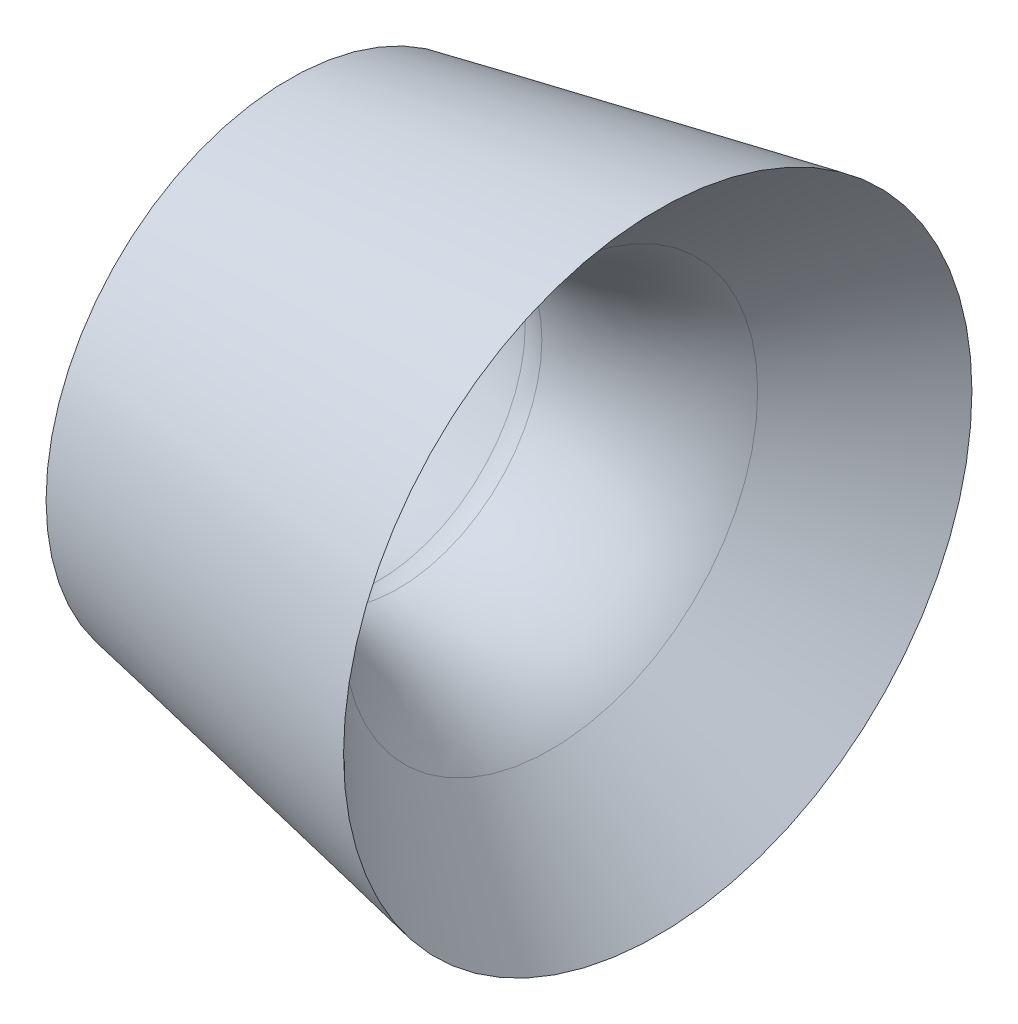
ISO-10303-21;
HEADER;
FILE_DESCRIPTION(('STEP AP214'),'2;1');
FILE_NAME('part.step','',(''),(''),'','','');
FILE_SCHEMA(('AUTOMOTIVE_DESIGN { 1 0 10303 214 1 1 1 1 }'));
ENDSEC;
DATA;
#1=APPLICATION_CONTEXT('core data for automotive mechanical design processes');
#2=APPLICATION_PROTOCOL_DEFINITION('international standard','automotive_design',2000,#1);
#3=PRODUCT_CONTEXT('',#1,'mechanical');
#4=PRODUCT('Part','Part','',(#3));
#5=PRODUCT_RELATED_PRODUCT_CATEGORY('part','',(#4));
#6=PRODUCT_DEFINITION_FORMATION('','',#4);
#7=PRODUCT_DEFINITION_CONTEXT('part definition',#1,'design');
#8=PRODUCT_DEFINITION('design','',#6,#7);
#9=PRODUCT_DEFINITION_SHAPE('','',#8);
#10=(LENGTH_UNIT() NAMED_UNIT(*) SI_UNIT(.MILLI.,.METRE.));
#11=(NAMED_UNIT(*) PLANE_ANGLE_UNIT() SI_UNIT($,.RADIAN.));
#12=(NAMED_UNIT(*) SI_UNIT($,.STERADIAN.) SOLID_ANGLE_UNIT());
#13=UNCERTAINTY_MEASURE_WITH_UNIT(LENGTH_MEASURE(1.E-05),#10,'distance_accuracy_value','');
#14=(GEOMETRIC_REPRESENTATION_CONTEXT(3) GLOBAL_UNCERTAINTY_ASSIGNED_CONTEXT((#13)) GLOBAL_UNIT_ASSIGNED_CONTEXT((#10,
#11,#12)) REPRESENTATION_CONTEXT('',''));
#15=CARTESIAN_POINT('',(0.,0.,0.));
#16=DIRECTION('',(0.,0.,1.));
#17=DIRECTION('',(1.,0.,0.));
#18=AXIS2_PLACEMENT_3D('',#15,#16,#17);
#19=CARTESIAN_POINT('',(-126.689985290283,0.,0.));
#20=DIRECTION('',(1.,0.,0.));
#21=DIRECTION('',(0.,0.,-1.));
#22=AXIS2_PLACEMENT_3D('',#19,#20,#21);
#23=DEGENERATE_TOROIDAL_SURFACE('',#22,246.300088186458,278.325833730919,.F.);
#24=CARTESIAN_POINT('',(-28.7013656041704,0.,0.));
#25=DIRECTION('',(1.,0.,0.));
#26=DIRECTION('',(0.,0.,-1.));
#27=AXIS2_PLACEMENT_3D('',#24,#25,#26);
#28=CIRCLE('',#27,14.2061499999265);
#29=CARTESIAN_POINT('',(-28.7013656041704,0.,-14.2061499999265));
#30=VERTEX_POINT('',#29);
#31=EDGE_CURVE('E60',#30,#30,#28,.T.);
#32=ORIENTED_EDGE('',*,*,#31,.F.);
#33=EDGE_LOOP('',(#32));
#34=FACE_BOUND('',#33,.T.);
#35=CARTESIAN_POINT('',(-21.8410843336382,0.,0.));
#36=DIRECTION('',(1.,0.,0.));
#37=DIRECTION('',(0.,0.,-1.));
#38=AXIS2_PLACEMENT_3D('',#35,#36,#37);
#39=CIRCLE('',#38,11.5215123248156);
#40=CARTESIAN_POINT('',(-21.8410843336382,0.,-11.5215123248156));
#41=VERTEX_POINT('',#40);
#42=EDGE_CURVE('E10',#41,#41,#39,.T.);
#43=ORIENTED_EDGE('',*,*,#42,.T.);
#44=EDGE_LOOP('',(#43));
#45=FACE_BOUND('',#44,.T.);
#46=ADVANCED_FACE('F38',(#34,#45),#23,.T.);
#47=CARTESIAN_POINT('',(-20.2284713276538,0.,0.));
#48=DIRECTION('',(1.,0.,0.));
#49=DIRECTION('',(0.,0.,-1.));
#50=AXIS2_PLACEMENT_3D('',#47,#48,#49);
#51=TOROIDAL_SURFACE('',#50,15.4868992999267,4.28074930000007);
#52=ORIENTED_EDGE('',*,*,#42,.F.);
#53=EDGE_LOOP('',(#52));
#54=FACE_BOUND('',#53,.T.);
#55=CARTESIAN_POINT('',(-20.2284713276513,0.,0.));
#56=DIRECTION('',(1.,0.,0.));
#57=DIRECTION('',(0.,0.,-1.));
#58=AXIS2_PLACEMENT_3D('',#55,#56,#57);
#59=CIRCLE('',#58,11.2061499999271);
#60=CARTESIAN_POINT('',(-20.2284713276513,0.,-11.2061499999271));
#61=VERTEX_POINT('',#60);
#62=EDGE_CURVE('E44',#61,#61,#59,.T.);
#63=ORIENTED_EDGE('',*,*,#62,.T.);
#64=EDGE_LOOP('',(#63));
#65=FACE_BOUND('',#64,.T.);
#66=ADVANCED_FACE('F68',(#54,#65),#51,.T.);
#67=CARTESIAN_POINT('',(-20.2284713276513,0.,0.));
#68=DIRECTION('',(1.,0.,0.));
#69=DIRECTION('',(0.,0.,-1.));
#70=AXIS2_PLACEMENT_3D('',#67,#68,#69);
#71=TOROIDAL_SURFACE('',#70,28.0153749999243,16.8092249999972);
#72=ORIENTED_EDGE('',*,*,#62,.F.);
#73=EDGE_LOOP('',(#72));
#74=FACE_BOUND('',#73,.T.);
#75=CARTESIAN_POINT('',(-8.3425543436632,0.,0.));
#76=DIRECTION('',(1.,0.,0.));
#77=DIRECTION('',(0.,0.,-1.));
#78=AXIS2_PLACEMENT_3D('',#75,#76,#77);
#79=CIRCLE('',#78,16.1294580159362);
#80=CARTESIAN_POINT('',(-8.3425543436632,0.,-16.1294580159362));
#81=VERTEX_POINT('',#80);
#82=EDGE_CURVE('E48',#81,#81,#79,.T.);
#83=ORIENTED_EDGE('',*,*,#82,.T.);
#84=EDGE_LOOP('',(#83));
#85=FACE_BOUND('',#84,.T.);
#86=ADVANCED_FACE('F72',(#74,#85),#71,.T.);
#87=CARTESIAN_POINT('',(0.,0.,0.));
#88=DIRECTION('',(1.,0.,0.));
#89=DIRECTION('',(0.,0.,-1.));
#90=AXIS2_PLACEMENT_3D('',#87,#88,#89);
#91=CONICAL_SURFACE('',#90,24.4720123595993,0.785398163397445);
#92=ORIENTED_EDGE('',*,*,#82,.F.);
#93=EDGE_LOOP('',(#92));
#94=FACE_BOUND('',#93,.T.);
#95=CARTESIAN_POINT('',(0.,0.,0.));
#96=DIRECTION('',(1.,0.,0.));
#97=DIRECTION('',(0.,0.,-1.));
#98=AXIS2_PLACEMENT_3D('',#95,#96,#97);
#99=CIRCLE('',#98,24.4720123595993);
#100=CARTESIAN_POINT('',(0.,0.,-24.4720123595993));
#101=VERTEX_POINT('',#100);
#102=EDGE_CURVE('E52',#101,#101,#99,.T.);
#103=ORIENTED_EDGE('',*,*,#102,.T.);
#104=EDGE_LOOP('',(#103));
#105=FACE_BOUND('',#104,.T.);
#106=ADVANCED_FACE('F77',(#94,#105),#91,.F.);
#107=CARTESIAN_POINT('',(-28.7013656041704,0.,0.));
#108=DIRECTION('',(1.,0.,0.));
#109=DIRECTION('',(0.,0.,-1.));
#110=AXIS2_PLACEMENT_3D('',#107,#108,#109);
#111=CONICAL_SURFACE('',#110,18.9411893805684,0.190368922846339);
#112=ORIENTED_EDGE('',*,*,#102,.F.);
#113=EDGE_LOOP('',(#112));
#114=FACE_BOUND('',#113,.T.);
#115=CARTESIAN_POINT('',(-28.7013656041704,0.,0.));
#116=DIRECTION('',(1.,0.,0.));
#117=DIRECTION('',(0.,0.,-1.));
#118=AXIS2_PLACEMENT_3D('',#115,#116,#117);
#119=CIRCLE('',#118,18.9411893805684);
#120=CARTESIAN_POINT('',(-28.7013656041704,0.,-18.9411893805684));
#121=VERTEX_POINT('',#120);
#122=EDGE_CURVE('E57',#121,#121,#119,.T.);
#123=ORIENTED_EDGE('',*,*,#122,.T.);
#124=EDGE_LOOP('',(#123));
#125=FACE_BOUND('',#124,.T.);
#126=ADVANCED_FACE('F83',(#114,#125),#111,.T.);
#127=CARTESIAN_POINT('',(-28.7013656041704,1.68239978437176E-13,0.));
#128=DIRECTION('',(-1.,0.,0.));
#129=DIRECTION('',(0.,0.,1.));
#130=AXIS2_PLACEMENT_3D('',#127,#128,#129);
#131=PLANE('',#130);
#132=ORIENTED_EDGE('',*,*,#31,.T.);
#133=EDGE_LOOP('',(#132));
#134=FACE_BOUND('',#133,.T.);
#135=ORIENTED_EDGE('',*,*,#122,.F.);
#136=EDGE_LOOP('',(#135));
#137=FACE_BOUND('',#136,.T.);
#138=ADVANCED_FACE('F64',(#134,#137),#131,.T.);
#139=CLOSED_SHELL('',(#46,#66,#86,#106,#126,#138));
#140=MANIFOLD_SOLID_BREP('B2',#139);
#141=ADVANCED_BREP_SHAPE_REPRESENTATION('',(#18,#140),#14);
#142=SHAPE_DEFINITION_REPRESENTATION(#9,#141);
ENDSEC;
END-ISO-10303-21;
